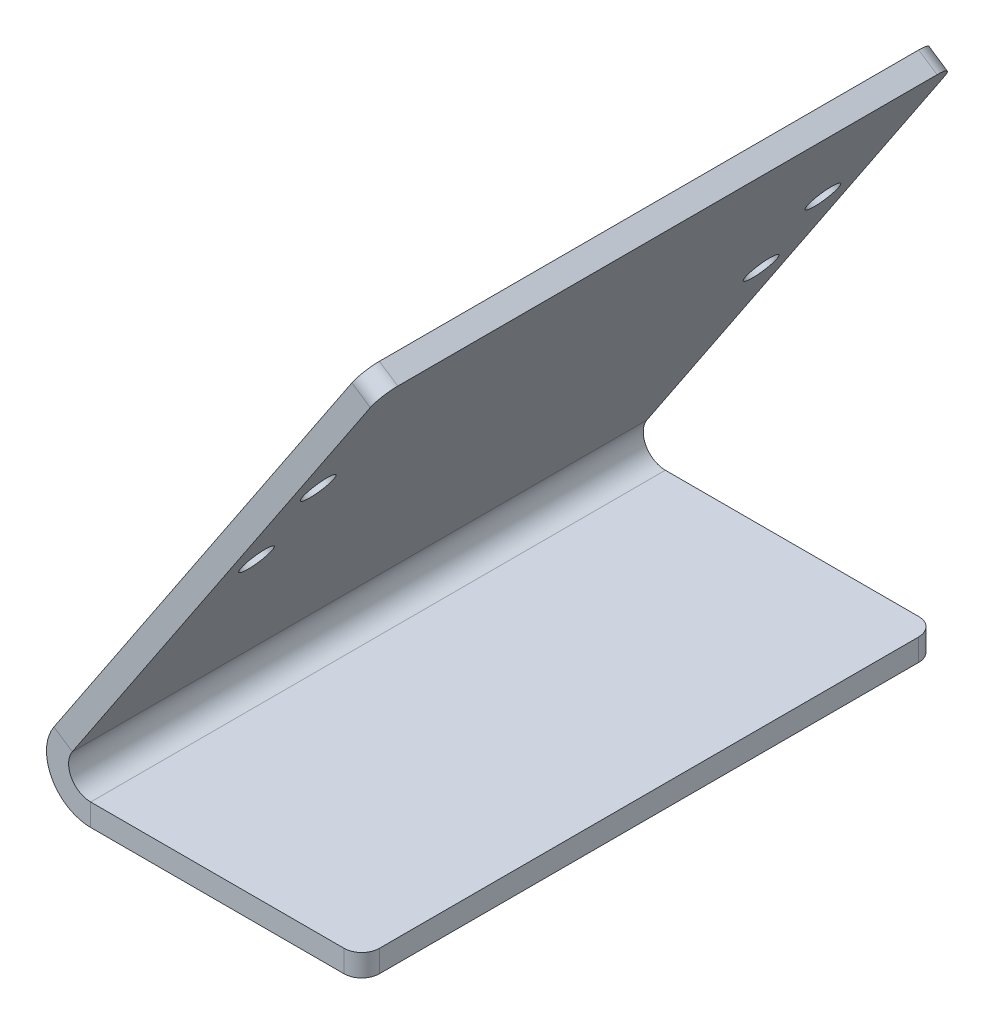
ISO-10303-21;
HEADER;
FILE_DESCRIPTION(('STEP AP214'),'2;1');
FILE_NAME('part.step','',(''),(''),'','','');
FILE_SCHEMA(('AUTOMOTIVE_DESIGN { 1 0 10303 214 1 1 1 1 }'));
ENDSEC;
DATA;
#1=APPLICATION_CONTEXT('core data for automotive mechanical design processes');
#2=APPLICATION_PROTOCOL_DEFINITION('international standard','automotive_design',2000,#1);
#3=PRODUCT_CONTEXT('',#1,'mechanical');
#4=PRODUCT('Part','Part','',(#3));
#5=PRODUCT_RELATED_PRODUCT_CATEGORY('part','',(#4));
#6=PRODUCT_DEFINITION_FORMATION('','',#4);
#7=PRODUCT_DEFINITION_CONTEXT('part definition',#1,'design');
#8=PRODUCT_DEFINITION('design','',#6,#7);
#9=PRODUCT_DEFINITION_SHAPE('','',#8);
#10=(LENGTH_UNIT() NAMED_UNIT(*) SI_UNIT(.MILLI.,.METRE.));
#11=(NAMED_UNIT(*) PLANE_ANGLE_UNIT() SI_UNIT($,.RADIAN.));
#12=(NAMED_UNIT(*) SI_UNIT($,.STERADIAN.) SOLID_ANGLE_UNIT());
#13=UNCERTAINTY_MEASURE_WITH_UNIT(LENGTH_MEASURE(1.E-05),#10,'distance_accuracy_value','');
#14=(GEOMETRIC_REPRESENTATION_CONTEXT(3) GLOBAL_UNCERTAINTY_ASSIGNED_CONTEXT((#13)) GLOBAL_UNIT_ASSIGNED_CONTEXT((#10,
#11,#12)) REPRESENTATION_CONTEXT('',''));
#15=CARTESIAN_POINT('',(0.,0.,0.));
#16=DIRECTION('',(0.,0.,1.));
#17=DIRECTION('',(1.,0.,0.));
#18=AXIS2_PLACEMENT_3D('',#15,#16,#17);
#19=CARTESIAN_POINT('',(0.,-38.1,-41.275));
#20=DIRECTION('',(0.,0.,1.));
#21=DIRECTION('',(-1.,0.,0.));
#22=AXIS2_PLACEMENT_3D('',#19,#20,#21);
#23=PLANE('',#22);
#24=DIRECTION('',(1.,0.,0.));
#25=VECTOR('',#24,1.);
#26=CARTESIAN_POINT('',(0.,-34.925,-41.275));
#27=LINE('',#26,#25);
#28=CARTESIAN_POINT('',(22.86,-34.925,-41.275));
#29=VERTEX_POINT('',#28);
#30=CARTESIAN_POINT('',(-13.5349164669346,-34.925,-41.275));
#31=VERTEX_POINT('',#30);
#32=EDGE_CURVE('E194',#29,#31,#27,.F.);
#33=ORIENTED_EDGE('',*,*,#32,.F.);
#34=DIRECTION('',(0.,1.,0.));
#35=VECTOR('',#34,1.);
#36=CARTESIAN_POINT('',(22.86,-38.1,-41.275));
#37=LINE('',#36,#35);
#38=CARTESIAN_POINT('',(22.86,-38.1,-41.275));
#39=VERTEX_POINT('',#38);
#40=EDGE_CURVE('E136',#29,#39,#37,.F.);
#41=ORIENTED_EDGE('',*,*,#40,.T.);
#42=DIRECTION('',(-1.,0.,0.));
#43=VECTOR('',#42,1.);
#44=CARTESIAN_POINT('',(0.,-38.1,-41.275));
#45=LINE('',#44,#43);
#46=CARTESIAN_POINT('',(-13.5349164669346,-38.1,-41.275));
#47=VERTEX_POINT('',#46);
#48=EDGE_CURVE('E130',#39,#47,#45,.T.);
#49=ORIENTED_EDGE('',*,*,#48,.T.);
#50=DIRECTION('',(0.,-1.,0.));
#51=VECTOR('',#50,1.);
#52=CARTESIAN_POINT('',(-13.5349164669346,-38.1,-41.275));
#53=LINE('',#52,#51);
#54=EDGE_CURVE('E133',#31,#47,#53,.T.);
#55=ORIENTED_EDGE('',*,*,#54,.F.);
#56=EDGE_LOOP('',(#33,#41,#49,#55));
#57=FACE_BOUND('',#56,.T.);
#58=ADVANCED_FACE('F38',(#57),#23,.F.);
#59=CARTESIAN_POINT('',(25.4,-38.1,41.275));
#60=DIRECTION('',(-1.,0.,0.));
#61=DIRECTION('',(0.,0.,-1.));
#62=AXIS2_PLACEMENT_3D('',#59,#60,#61);
#63=PLANE('',#62);
#64=DIRECTION('',(0.,0.,1.));
#65=VECTOR('',#64,1.);
#66=CARTESIAN_POINT('',(25.4,-34.925,41.275));
#67=LINE('',#66,#65);
#68=CARTESIAN_POINT('',(25.4,-34.925,38.735));
#69=VERTEX_POINT('',#68);
#70=CARTESIAN_POINT('',(25.4,-34.925,-38.735));
#71=VERTEX_POINT('',#70);
#72=EDGE_CURVE('E196',#69,#71,#67,.F.);
#73=ORIENTED_EDGE('',*,*,#72,.F.);
#74=DIRECTION('',(0.,-1.,0.));
#75=VECTOR('',#74,1.);
#76=CARTESIAN_POINT('',(25.4,-38.1,38.735));
#77=LINE('',#76,#75);
#78=CARTESIAN_POINT('',(25.4,-38.1,38.735));
#79=VERTEX_POINT('',#78);
#80=EDGE_CURVE('E209',#69,#79,#77,.T.);
#81=ORIENTED_EDGE('',*,*,#80,.T.);
#82=DIRECTION('',(0.,0.,-1.));
#83=VECTOR('',#82,1.);
#84=CARTESIAN_POINT('',(25.4,-38.1,41.275));
#85=LINE('',#84,#83);
#86=CARTESIAN_POINT('',(25.4,-38.1,-38.735));
#87=VERTEX_POINT('',#86);
#88=EDGE_CURVE('E139',#79,#87,#85,.T.);
#89=ORIENTED_EDGE('',*,*,#88,.T.);
#90=DIRECTION('',(0.,1.,0.));
#91=VECTOR('',#90,1.);
#92=CARTESIAN_POINT('',(25.4,-38.1,-38.735));
#93=LINE('',#92,#91);
#94=EDGE_CURVE('E152',#87,#71,#93,.T.);
#95=ORIENTED_EDGE('',*,*,#94,.T.);
#96=EDGE_LOOP('',(#73,#81,#89,#95));
#97=FACE_BOUND('',#96,.T.);
#98=ADVANCED_FACE('F306',(#97),#63,.F.);
#99=CARTESIAN_POINT('',(0.,-38.1,41.275));
#100=DIRECTION('',(0.,0.,1.));
#101=DIRECTION('',(-1.,0.,0.));
#102=AXIS2_PLACEMENT_3D('',#99,#100,#101);
#103=PLANE('',#102);
#104=DIRECTION('',(-1.,0.,0.));
#105=VECTOR('',#104,1.);
#106=CARTESIAN_POINT('',(0.,-38.1,41.275));
#107=LINE('',#106,#105);
#108=CARTESIAN_POINT('',(22.86,-38.1,41.275));
#109=VERTEX_POINT('',#108);
#110=CARTESIAN_POINT('',(-13.5349164669346,-38.1,41.275));
#111=VERTEX_POINT('',#110);
#112=EDGE_CURVE('E167',#109,#111,#107,.T.);
#113=ORIENTED_EDGE('',*,*,#112,.F.);
#114=DIRECTION('',(0.,1.,0.));
#115=VECTOR('',#114,1.);
#116=CARTESIAN_POINT('',(22.86,-38.1,41.275));
#117=LINE('',#116,#115);
#118=CARTESIAN_POINT('',(22.86,-34.925,41.275));
#119=VERTEX_POINT('',#118);
#120=EDGE_CURVE('E216',#109,#119,#117,.T.);
#121=ORIENTED_EDGE('',*,*,#120,.T.);
#122=DIRECTION('',(1.,0.,0.));
#123=VECTOR('',#122,1.);
#124=CARTESIAN_POINT('',(0.,-34.925,41.275));
#125=LINE('',#124,#123);
#126=CARTESIAN_POINT('',(-13.5349164669346,-34.925,41.275));
#127=VERTEX_POINT('',#126);
#128=EDGE_CURVE('E187',#119,#127,#125,.F.);
#129=ORIENTED_EDGE('',*,*,#128,.T.);
#130=DIRECTION('',(0.,-1.,0.));
#131=VECTOR('',#130,1.);
#132=CARTESIAN_POINT('',(-13.5349164669346,-38.1,41.275));
#133=LINE('',#132,#131);
#134=EDGE_CURVE('E153',#127,#111,#133,.T.);
#135=ORIENTED_EDGE('',*,*,#134,.T.);
#136=EDGE_LOOP('',(#113,#121,#129,#135));
#137=FACE_BOUND('',#136,.T.);
#138=ADVANCED_FACE('F312',(#137),#103,.T.);
#139=CARTESIAN_POINT('',(-13.5349164669346,-31.75,41.275));
#140=DIRECTION('',(0.,0.,1.));
#141=DIRECTION('',(1.,0.,0.));
#142=AXIS2_PLACEMENT_3D('',#139,#140,#141);
#143=PLANE('',#142);
#144=ORIENTED_EDGE('',*,*,#134,.F.);
#145=CARTESIAN_POINT('',(-13.5349164669346,-31.75,41.275));
#146=DIRECTION('',(0.,0.,1.));
#147=DIRECTION('',(1.,0.,0.));
#148=AXIS2_PLACEMENT_3D('',#145,#146,#147);
#149=CIRCLE('',#148,3.175);
#150=CARTESIAN_POINT('',(-16.1766761514572,-29.9888268769849,41.275));
#151=VERTEX_POINT('',#150);
#152=EDGE_CURVE('E191',#127,#151,#149,.F.);
#153=ORIENTED_EDGE('',*,*,#152,.T.);
#154=DIRECTION('',(-0.832050294337844,0.554700196225229,0.));
#155=VECTOR('',#154,1.);
#156=CARTESIAN_POINT('',(-18.8184358359799,-28.2276537539698,41.275));
#157=LINE('',#156,#155);
#158=CARTESIAN_POINT('',(-18.8184358359799,-28.2276537539698,41.275));
#159=VERTEX_POINT('',#158);
#160=EDGE_CURVE('E202',#151,#159,#157,.T.);
#161=ORIENTED_EDGE('',*,*,#160,.T.);
#162=CARTESIAN_POINT('',(-13.5349164669346,-31.75,41.275));
#163=DIRECTION('',(0.,0.,-1.));
#164=DIRECTION('',(-1.,0.,0.));
#165=AXIS2_PLACEMENT_3D('',#162,#163,#164);
#166=CIRCLE('',#165,6.35);
#167=EDGE_CURVE('E140',#111,#159,#166,.T.);
#168=ORIENTED_EDGE('',*,*,#167,.F.);
#169=EDGE_LOOP('',(#144,#153,#161,#168));
#170=FACE_BOUND('',#169,.T.);
#171=ADVANCED_FACE('F352',(#170),#143,.T.);
#172=CARTESIAN_POINT('',(0.,0.,41.275));
#173=DIRECTION('',(0.,0.,1.));
#174=DIRECTION('',(-0.554700196225229,-0.832050294337844,0.));
#175=AXIS2_PLACEMENT_3D('',#172,#173,#174);
#176=PLANE('',#175);
#177=DIRECTION('',(0.554700196225229,0.832050294337844,0.));
#178=VECTOR('',#177,1.);
#179=CARTESIAN_POINT('',(2.64175968452265,-1.7611731230151,41.275));
#180=LINE('',#179,#178);
#181=CARTESIAN_POINT('',(26.6328211861106,34.2254191293668,41.275));
#182=VERTEX_POINT('',#181);
#183=EDGE_CURVE('E186',#182,#151,#180,.F.);
#184=ORIENTED_EDGE('',*,*,#183,.F.);
#185=DIRECTION('',(0.832050294337844,-0.554700196225229,0.));
#186=VECTOR('',#185,1.);
#187=CARTESIAN_POINT('',(23.9910615015879,35.9865922523819,41.275));
#188=LINE('',#187,#186);
#189=CARTESIAN_POINT('',(23.9910615015879,35.9865922523819,41.275));
#190=VERTEX_POINT('',#189);
#191=EDGE_CURVE('E11',#182,#190,#188,.F.);
#192=ORIENTED_EDGE('',*,*,#191,.T.);
#193=DIRECTION('',(-0.554700196225229,-0.832050294337844,0.));
#194=VECTOR('',#193,1.);
#195=CARTESIAN_POINT('',(0.,0.,41.275));
#196=LINE('',#195,#194);
#197=EDGE_CURVE('E174',#190,#159,#196,.T.);
#198=ORIENTED_EDGE('',*,*,#197,.T.);
#199=ORIENTED_EDGE('',*,*,#160,.F.);
#200=EDGE_LOOP('',(#184,#192,#198,#199));
#201=FACE_BOUND('',#200,.T.);
#202=ADVANCED_FACE('F336',(#201),#176,.T.);
#203=CARTESIAN_POINT('',(25.4,38.1,41.275));
#204=DIRECTION('',(-0.554700196225229,-0.832050294337844,0.));
#205=DIRECTION('',(0.,0.,-1.));
#206=AXIS2_PLACEMENT_3D('',#203,#204,#205);
#207=PLANE('',#206);
#208=DIRECTION('',(0.,0.,1.));
#209=VECTOR('',#208,1.);
#210=CARTESIAN_POINT('',(28.0417596845226,36.3388268769849,41.275));
#211=LINE('',#210,#209);
#212=CARTESIAN_POINT('',(28.0417596845226,36.3388268769849,38.735));
#213=VERTEX_POINT('',#212);
#214=CARTESIAN_POINT('',(28.0417596845226,36.3388268769849,-38.735));
#215=VERTEX_POINT('',#214);
#216=EDGE_CURVE('E183',#213,#215,#211,.F.);
#217=ORIENTED_EDGE('',*,*,#216,.T.);
#218=DIRECTION('',(0.832050294337844,-0.554700196225229,0.));
#219=VECTOR('',#218,1.);
#220=CARTESIAN_POINT('',(25.4,38.1,-38.735));
#221=LINE('',#220,#219);
#222=CARTESIAN_POINT('',(25.4,38.1,-38.735));
#223=VERTEX_POINT('',#222);
#224=EDGE_CURVE('E225',#215,#223,#221,.F.);
#225=ORIENTED_EDGE('',*,*,#224,.T.);
#226=DIRECTION('',(0.,0.,-1.));
#227=VECTOR('',#226,1.);
#228=CARTESIAN_POINT('',(25.4,38.1,41.275));
#229=LINE('',#228,#227);
#230=CARTESIAN_POINT('',(25.4,38.1,38.735));
#231=VERTEX_POINT('',#230);
#232=EDGE_CURVE('E169',#231,#223,#229,.T.);
#233=ORIENTED_EDGE('',*,*,#232,.F.);
#234=DIRECTION('',(-0.832050294337844,0.554700196225229,0.));
#235=VECTOR('',#234,1.);
#236=CARTESIAN_POINT('',(25.4,38.1,38.735));
#237=LINE('',#236,#235);
#238=EDGE_CURVE('E223',#231,#213,#237,.F.);
#239=ORIENTED_EDGE('',*,*,#238,.T.);
#240=EDGE_LOOP('',(#217,#225,#233,#239));
#241=FACE_BOUND('',#240,.T.);
#242=ADVANCED_FACE('F239',(#241),#207,.F.);
#243=CARTESIAN_POINT('',(0.,0.,-41.275));
#244=DIRECTION('',(0.,0.,1.));
#245=DIRECTION('',(-0.554700196225229,-0.832050294337844,0.));
#246=AXIS2_PLACEMENT_3D('',#243,#244,#245);
#247=PLANE('',#246);
#248=DIRECTION('',(-0.554700196225229,-0.832050294337844,0.));
#249=VECTOR('',#248,1.);
#250=CARTESIAN_POINT('',(0.,0.,-41.275));
#251=LINE('',#250,#249);
#252=CARTESIAN_POINT('',(23.9910615015879,35.9865922523819,-41.275));
#253=VERTEX_POINT('',#252);
#254=CARTESIAN_POINT('',(-18.8184358359799,-28.2276537539698,-41.275));
#255=VERTEX_POINT('',#254);
#256=EDGE_CURVE('E245',#253,#255,#251,.T.);
#257=ORIENTED_EDGE('',*,*,#256,.F.);
#258=DIRECTION('',(0.832050294337844,-0.554700196225229,0.));
#259=VECTOR('',#258,1.);
#260=CARTESIAN_POINT('',(23.9910615015879,35.9865922523819,-41.275));
#261=LINE('',#260,#259);
#262=CARTESIAN_POINT('',(26.6328211861106,34.2254191293668,-41.275));
#263=VERTEX_POINT('',#262);
#264=EDGE_CURVE('E61',#253,#263,#261,.T.);
#265=ORIENTED_EDGE('',*,*,#264,.T.);
#266=DIRECTION('',(0.554700196225229,0.832050294337844,0.));
#267=VECTOR('',#266,1.);
#268=CARTESIAN_POINT('',(2.64175968452265,-1.7611731230151,-41.275));
#269=LINE('',#268,#267);
#270=CARTESIAN_POINT('',(-16.1766761514572,-29.9888268769849,-41.275));
#271=VERTEX_POINT('',#270);
#272=EDGE_CURVE('E184',#263,#271,#269,.F.);
#273=ORIENTED_EDGE('',*,*,#272,.T.);
#274=DIRECTION('',(-0.832050294337844,0.554700196225229,0.));
#275=VECTOR('',#274,1.);
#276=CARTESIAN_POINT('',(-18.8184358359799,-28.2276537539698,-41.275));
#277=LINE('',#276,#275);
#278=EDGE_CURVE('E171',#271,#255,#277,.T.);
#279=ORIENTED_EDGE('',*,*,#278,.T.);
#280=EDGE_LOOP('',(#257,#265,#273,#279));
#281=FACE_BOUND('',#280,.T.);
#282=ADVANCED_FACE('F246',(#281),#247,.F.);
#283=CARTESIAN_POINT('',(-13.5349164669346,-31.75,-41.275));
#284=DIRECTION('',(0.,0.,-1.));
#285=DIRECTION('',(-1.,0.,0.));
#286=AXIS2_PLACEMENT_3D('',#283,#284,#285);
#287=PLANE('',#286);
#288=CARTESIAN_POINT('',(-13.5349164669346,-31.75,-41.275));
#289=DIRECTION('',(0.,0.,1.));
#290=DIRECTION('',(1.,0.,0.));
#291=AXIS2_PLACEMENT_3D('',#288,#289,#290);
#292=CIRCLE('',#291,3.175);
#293=EDGE_CURVE('E151',#271,#31,#292,.T.);
#294=ORIENTED_EDGE('',*,*,#293,.T.);
#295=ORIENTED_EDGE('',*,*,#54,.T.);
#296=CARTESIAN_POINT('',(-13.5349164669346,-31.75,-41.275));
#297=DIRECTION('',(0.,0.,1.));
#298=DIRECTION('',(1.,0.,0.));
#299=AXIS2_PLACEMENT_3D('',#296,#297,#298);
#300=CIRCLE('',#299,6.35);
#301=EDGE_CURVE('E148',#255,#47,#300,.T.);
#302=ORIENTED_EDGE('',*,*,#301,.F.);
#303=ORIENTED_EDGE('',*,*,#278,.F.);
#304=EDGE_LOOP('',(#294,#295,#302,#303));
#305=FACE_BOUND('',#304,.T.);
#306=ADVANCED_FACE('F146',(#305),#287,.T.);
#307=CARTESIAN_POINT('',(0.,0.,41.275));
#308=DIRECTION('',(0.832050294337844,-0.554700196225229,0.));
#309=DIRECTION('',(0.554700196225229,0.832050294337844,0.));
#310=AXIS2_PLACEMENT_3D('',#307,#308,#309);
#311=PLANE('',#310);
#312=CARTESIAN_POINT('',(11.4828487620585,17.2242731430877,36.2458));
#313=DIRECTION('',(-0.832050294337844,0.554700196225229,0.));
#314=DIRECTION('',(-0.554700196225229,-0.832050294337844,0.));
#315=AXIS2_PLACEMENT_3D('',#312,#313,#314);
#316=CIRCLE('',#315,2.2479);
#317=CARTESIAN_POINT('',(10.2359381909638,15.3539072864457,36.2458));
#318=VERTEX_POINT('',#317);
#319=EDGE_CURVE('E255',#318,#318,#316,.T.);
#320=ORIENTED_EDGE('',*,*,#319,.F.);
#321=EDGE_LOOP('',(#320));
#322=FACE_BOUND('',#321,.T.);
#323=CARTESIAN_POINT('',(2.60653622206235,3.90980433309352,-36.2458));
#324=DIRECTION('',(-0.832050294337844,0.554700196225229,0.));
#325=DIRECTION('',(-0.554700196225229,-0.832050294337844,0.));
#326=AXIS2_PLACEMENT_3D('',#323,#324,#325);
#327=CIRCLE('',#326,2.2479);
#328=CARTESIAN_POINT('',(1.35962565096766,2.03943847645148,-36.2458));
#329=VERTEX_POINT('',#328);
#330=EDGE_CURVE('E267',#329,#329,#327,.T.);
#331=ORIENTED_EDGE('',*,*,#330,.F.);
#332=EDGE_LOOP('',(#331));
#333=FACE_BOUND('',#332,.T.);
#334=CARTESIAN_POINT('',(2.60653622206235,3.90980433309353,36.2458));
#335=DIRECTION('',(-0.832050294337844,0.554700196225229,0.));
#336=DIRECTION('',(-0.554700196225229,-0.832050294337844,0.));
#337=AXIS2_PLACEMENT_3D('',#334,#335,#336);
#338=CIRCLE('',#337,2.2479);
#339=CARTESIAN_POINT('',(1.35962565096766,2.03943847645149,36.2458));
#340=VERTEX_POINT('',#339);
#341=EDGE_CURVE('E261',#340,#340,#338,.T.);
#342=ORIENTED_EDGE('',*,*,#341,.F.);
#343=EDGE_LOOP('',(#342));
#344=FACE_BOUND('',#343,.T.);
#345=CARTESIAN_POINT('',(11.4828487620585,17.2242731430877,-36.2458));
#346=DIRECTION('',(-0.832050294337844,0.554700196225229,0.));
#347=DIRECTION('',(-0.554700196225229,-0.832050294337844,0.));
#348=AXIS2_PLACEMENT_3D('',#345,#346,#347);
#349=CIRCLE('',#348,2.2479);
#350=CARTESIAN_POINT('',(10.2359381909638,15.3539072864457,-36.2458));
#351=VERTEX_POINT('',#350);
#352=EDGE_CURVE('E201',#351,#351,#349,.T.);
#353=ORIENTED_EDGE('',*,*,#352,.F.);
#354=EDGE_LOOP('',(#353));
#355=FACE_BOUND('',#354,.T.);
#356=ORIENTED_EDGE('',*,*,#232,.T.);
#357=CARTESIAN_POINT('',(23.9910615015879,35.9865922523819,-38.735));
#358=DIRECTION('',(0.832050294337844,-0.554700196225229,0.));
#359=DIRECTION('',(0.554700196225229,0.832050294337844,0.));
#360=AXIS2_PLACEMENT_3D('',#357,#358,#359);
#361=CIRCLE('',#360,2.54);
#362=EDGE_CURVE('E230',#223,#253,#361,.F.);
#363=ORIENTED_EDGE('',*,*,#362,.T.);
#364=ORIENTED_EDGE('',*,*,#256,.T.);
#365=DIRECTION('',(0.,0.,-1.));
#366=VECTOR('',#365,1.);
#367=CARTESIAN_POINT('',(-18.8184358359799,-28.2276537539698,41.275));
#368=LINE('',#367,#366);
#369=EDGE_CURVE('E161',#255,#159,#368,.F.);
#370=ORIENTED_EDGE('',*,*,#369,.T.);
#371=ORIENTED_EDGE('',*,*,#197,.F.);
#372=CARTESIAN_POINT('',(23.9910615015879,35.9865922523819,38.735));
#373=DIRECTION('',(0.832050294337844,-0.554700196225229,0.));
#374=DIRECTION('',(0.554700196225229,0.832050294337844,0.));
#375=AXIS2_PLACEMENT_3D('',#372,#373,#374);
#376=CIRCLE('',#375,2.54);
#377=EDGE_CURVE('E228',#190,#231,#376,.F.);
#378=ORIENTED_EDGE('',*,*,#377,.T.);
#379=EDGE_LOOP('',(#356,#363,#364,#370,#371,#378));
#380=FACE_BOUND('',#379,.T.);
#381=ADVANCED_FACE('F244',(#322,#333,#344,#355,#380),#311,.F.);
#382=CARTESIAN_POINT('',(0.,-38.1,41.275));
#383=DIRECTION('',(0.,-1.,0.));
#384=DIRECTION('',(1.,0.,0.));
#385=AXIS2_PLACEMENT_3D('',#382,#383,#384);
#386=PLANE('',#385);
#387=ORIENTED_EDGE('',*,*,#88,.F.);
#388=CARTESIAN_POINT('',(22.86,-38.1,38.735));
#389=DIRECTION('',(0.,-1.,0.));
#390=DIRECTION('',(1.,0.,0.));
#391=AXIS2_PLACEMENT_3D('',#388,#389,#390);
#392=CIRCLE('',#391,2.54);
#393=EDGE_CURVE('E214',#79,#109,#392,.T.);
#394=ORIENTED_EDGE('',*,*,#393,.T.);
#395=ORIENTED_EDGE('',*,*,#112,.T.);
#396=DIRECTION('',(0.,0.,-1.));
#397=VECTOR('',#396,1.);
#398=CARTESIAN_POINT('',(-13.5349164669346,-38.1,-41.275));
#399=LINE('',#398,#397);
#400=EDGE_CURVE('E159',#111,#47,#399,.T.);
#401=ORIENTED_EDGE('',*,*,#400,.T.);
#402=ORIENTED_EDGE('',*,*,#48,.F.);
#403=CARTESIAN_POINT('',(22.86,-38.1,-38.735));
#404=DIRECTION('',(0.,-1.,0.));
#405=DIRECTION('',(1.,0.,0.));
#406=AXIS2_PLACEMENT_3D('',#403,#404,#405);
#407=CIRCLE('',#406,2.54);
#408=EDGE_CURVE('E212',#39,#87,#407,.T.);
#409=ORIENTED_EDGE('',*,*,#408,.T.);
#410=EDGE_LOOP('',(#387,#394,#395,#401,#402,#409));
#411=FACE_BOUND('',#410,.T.);
#412=ADVANCED_FACE('F165',(#411),#386,.T.);
#413=CARTESIAN_POINT('',(-13.5349164669346,-31.75,41.275));
#414=DIRECTION('',(0.,0.,1.));
#415=DIRECTION('',(1.,0.,0.));
#416=AXIS2_PLACEMENT_3D('',#413,#414,#415);
#417=CYLINDRICAL_SURFACE('',#416,6.35);
#418=ORIENTED_EDGE('',*,*,#167,.T.);
#419=ORIENTED_EDGE('',*,*,#369,.F.);
#420=ORIENTED_EDGE('',*,*,#301,.T.);
#421=ORIENTED_EDGE('',*,*,#400,.F.);
#422=EDGE_LOOP('',(#418,#419,#420,#421));
#423=FACE_BOUND('',#422,.T.);
#424=ADVANCED_FACE('F158',(#423),#417,.T.);
#425=CARTESIAN_POINT('',(2.64175968452265,-1.7611731230151,41.275));
#426=DIRECTION('',(0.832050294337844,-0.554700196225229,0.));
#427=DIRECTION('',(0.554700196225229,0.832050294337844,0.));
#428=AXIS2_PLACEMENT_3D('',#425,#426,#427);
#429=PLANE('',#428);
#430=CARTESIAN_POINT('',(14.1246084465811,15.4631000200726,36.2458));
#431=DIRECTION('',(0.832050294337844,-0.554700196225229,0.));
#432=DIRECTION('',(0.554700196225229,0.832050294337844,0.));
#433=AXIS2_PLACEMENT_3D('',#430,#431,#432);
#434=CIRCLE('',#433,2.2479);
#435=CARTESIAN_POINT('',(15.3715190176758,17.3334658767146,36.2458));
#436=VERTEX_POINT('',#435);
#437=EDGE_CURVE('E270',#436,#436,#434,.F.);
#438=ORIENTED_EDGE('',*,*,#437,.T.);
#439=EDGE_LOOP('',(#438));
#440=FACE_BOUND('',#439,.T.);
#441=CARTESIAN_POINT('',(5.248295906585,2.14863121007842,-36.2458));
#442=DIRECTION('',(0.832050294337844,-0.554700196225229,0.));
#443=DIRECTION('',(0.554700196225229,0.832050294337844,0.));
#444=AXIS2_PLACEMENT_3D('',#441,#442,#443);
#445=CIRCLE('',#444,2.2479);
#446=CARTESIAN_POINT('',(6.49520647767969,4.01899706672046,-36.2458));
#447=VERTEX_POINT('',#446);
#448=EDGE_CURVE('E264',#447,#447,#445,.F.);
#449=ORIENTED_EDGE('',*,*,#448,.T.);
#450=EDGE_LOOP('',(#449));
#451=FACE_BOUND('',#450,.T.);
#452=CARTESIAN_POINT('',(5.248295906585,2.14863121007843,36.2458));
#453=DIRECTION('',(0.832050294337844,-0.554700196225229,0.));
#454=DIRECTION('',(0.554700196225229,0.832050294337844,0.));
#455=AXIS2_PLACEMENT_3D('',#452,#453,#454);
#456=CIRCLE('',#455,2.2479);
#457=CARTESIAN_POINT('',(6.49520647767969,4.01899706672047,36.2458));
#458=VERTEX_POINT('',#457);
#459=EDGE_CURVE('E258',#458,#458,#456,.F.);
#460=ORIENTED_EDGE('',*,*,#459,.T.);
#461=EDGE_LOOP('',(#460));
#462=FACE_BOUND('',#461,.T.);
#463=CARTESIAN_POINT('',(14.1246084465811,15.4631000200726,-36.2458));
#464=DIRECTION('',(0.832050294337844,-0.554700196225229,0.));
#465=DIRECTION('',(0.554700196225229,0.832050294337844,0.));
#466=AXIS2_PLACEMENT_3D('',#463,#464,#465);
#467=CIRCLE('',#466,2.2479);
#468=CARTESIAN_POINT('',(15.3715190176758,17.3334658767146,-36.2458));
#469=VERTEX_POINT('',#468);
#470=EDGE_CURVE('E252',#469,#469,#467,.F.);
#471=ORIENTED_EDGE('',*,*,#470,.T.);
#472=EDGE_LOOP('',(#471));
#473=FACE_BOUND('',#472,.T.);
#474=ORIENTED_EDGE('',*,*,#272,.F.);
#475=CARTESIAN_POINT('',(26.6328211861106,34.2254191293668,-38.735));
#476=DIRECTION('',(0.832050294337844,-0.554700196225229,0.));
#477=DIRECTION('',(0.554700196225229,0.832050294337844,0.));
#478=AXIS2_PLACEMENT_3D('',#475,#476,#477);
#479=CIRCLE('',#478,2.54);
#480=EDGE_CURVE('E46',#263,#215,#479,.T.);
#481=ORIENTED_EDGE('',*,*,#480,.T.);
#482=ORIENTED_EDGE('',*,*,#216,.F.);
#483=CARTESIAN_POINT('',(26.6328211861106,34.2254191293668,38.735));
#484=DIRECTION('',(0.832050294337844,-0.554700196225229,0.));
#485=DIRECTION('',(0.554700196225229,0.832050294337844,0.));
#486=AXIS2_PLACEMENT_3D('',#483,#484,#485);
#487=CIRCLE('',#486,2.54);
#488=EDGE_CURVE('E53',#213,#182,#487,.T.);
#489=ORIENTED_EDGE('',*,*,#488,.T.);
#490=ORIENTED_EDGE('',*,*,#183,.T.);
#491=DIRECTION('',(0.,0.,1.));
#492=VECTOR('',#491,1.);
#493=CARTESIAN_POINT('',(-16.1766761514572,-29.9888268769849,41.275));
#494=LINE('',#493,#492);
#495=EDGE_CURVE('E162',#271,#151,#494,.T.);
#496=ORIENTED_EDGE('',*,*,#495,.F.);
#497=EDGE_LOOP('',(#474,#481,#482,#489,#490,#496));
#498=FACE_BOUND('',#497,.T.);
#499=ADVANCED_FACE('F234',(#440,#451,#462,#473,#498),#429,.T.);
#500=CARTESIAN_POINT('',(0.,-34.925,41.275));
#501=DIRECTION('',(0.,-1.,0.));
#502=DIRECTION('',(1.,0.,0.));
#503=AXIS2_PLACEMENT_3D('',#500,#501,#502);
#504=PLANE('',#503);
#505=ORIENTED_EDGE('',*,*,#128,.F.);
#506=CARTESIAN_POINT('',(22.86,-34.925,38.735));
#507=DIRECTION('',(0.,-1.,0.));
#508=DIRECTION('',(1.,0.,0.));
#509=AXIS2_PLACEMENT_3D('',#506,#507,#508);
#510=CIRCLE('',#509,2.54);
#511=EDGE_CURVE('E220',#119,#69,#510,.F.);
#512=ORIENTED_EDGE('',*,*,#511,.T.);
#513=ORIENTED_EDGE('',*,*,#72,.T.);
#514=CARTESIAN_POINT('',(22.86,-34.925,-38.735));
#515=DIRECTION('',(0.,-1.,0.));
#516=DIRECTION('',(1.,0.,0.));
#517=AXIS2_PLACEMENT_3D('',#514,#515,#516);
#518=CIRCLE('',#517,2.54);
#519=EDGE_CURVE('E218',#71,#29,#518,.F.);
#520=ORIENTED_EDGE('',*,*,#519,.T.);
#521=ORIENTED_EDGE('',*,*,#32,.T.);
#522=DIRECTION('',(0.,0.,1.));
#523=VECTOR('',#522,1.);
#524=CARTESIAN_POINT('',(-13.5349164669346,-34.925,41.275));
#525=LINE('',#524,#523);
#526=EDGE_CURVE('E181',#127,#31,#525,.F.);
#527=ORIENTED_EDGE('',*,*,#526,.F.);
#528=EDGE_LOOP('',(#505,#512,#513,#520,#521,#527));
#529=FACE_BOUND('',#528,.T.);
#530=ADVANCED_FACE('F300',(#529),#504,.F.);
#531=CARTESIAN_POINT('',(-13.5349164669346,-31.75,41.275));
#532=DIRECTION('',(0.,0.,1.));
#533=DIRECTION('',(1.,0.,0.));
#534=AXIS2_PLACEMENT_3D('',#531,#532,#533);
#535=CYLINDRICAL_SURFACE('',#534,3.175);
#536=ORIENTED_EDGE('',*,*,#152,.F.);
#537=ORIENTED_EDGE('',*,*,#526,.T.);
#538=ORIENTED_EDGE('',*,*,#293,.F.);
#539=ORIENTED_EDGE('',*,*,#495,.T.);
#540=EDGE_LOOP('',(#536,#537,#538,#539));
#541=FACE_BOUND('',#540,.T.);
#542=ADVANCED_FACE('F290',(#541),#535,.F.);
#543=CARTESIAN_POINT('',(48.4821439282665,-7.44192363438429,-36.2458));
#544=DIRECTION('',(-0.832050294337844,0.554700196225229,0.));
#545=DIRECTION('',(-0.554700196225229,-0.832050294337844,0.));
#546=AXIS2_PLACEMENT_3D('',#543,#544,#545);
#547=CYLINDRICAL_SURFACE('',#546,2.2479);
#548=ORIENTED_EDGE('',*,*,#470,.F.);
#549=EDGE_LOOP('',(#548));
#550=FACE_BOUND('',#549,.T.);
#551=ORIENTED_EDGE('',*,*,#352,.T.);
#552=EDGE_LOOP('',(#551));
#553=FACE_BOUND('',#552,.T.);
#554=ADVANCED_FACE('F287',(#550,#553),#547,.F.);
#555=CARTESIAN_POINT('',(39.6058313882703,-20.7563924443785,36.2458));
#556=DIRECTION('',(-0.832050294337844,0.554700196225229,0.));
#557=DIRECTION('',(-0.554700196225229,-0.832050294337844,0.));
#558=AXIS2_PLACEMENT_3D('',#555,#556,#557);
#559=CYLINDRICAL_SURFACE('',#558,2.2479);
#560=ORIENTED_EDGE('',*,*,#459,.F.);
#561=EDGE_LOOP('',(#560));
#562=FACE_BOUND('',#561,.T.);
#563=ORIENTED_EDGE('',*,*,#341,.T.);
#564=EDGE_LOOP('',(#563));
#565=FACE_BOUND('',#564,.T.);
#566=ADVANCED_FACE('F289',(#562,#565),#559,.F.);
#567=CARTESIAN_POINT('',(39.6058313882703,-20.7563924443785,-36.2458));
#568=DIRECTION('',(-0.832050294337844,0.554700196225229,0.));
#569=DIRECTION('',(-0.554700196225229,-0.832050294337844,0.));
#570=AXIS2_PLACEMENT_3D('',#567,#568,#569);
#571=CYLINDRICAL_SURFACE('',#570,2.2479);
#572=ORIENTED_EDGE('',*,*,#448,.F.);
#573=EDGE_LOOP('',(#572));
#574=FACE_BOUND('',#573,.T.);
#575=ORIENTED_EDGE('',*,*,#330,.T.);
#576=EDGE_LOOP('',(#575));
#577=FACE_BOUND('',#576,.T.);
#578=ADVANCED_FACE('F297',(#574,#577),#571,.F.);
#579=CARTESIAN_POINT('',(48.4821439282665,-7.44192363438428,36.2458));
#580=DIRECTION('',(-0.832050294337844,0.554700196225229,0.));
#581=DIRECTION('',(-0.554700196225229,-0.832050294337844,0.));
#582=AXIS2_PLACEMENT_3D('',#579,#580,#581);
#583=CYLINDRICAL_SURFACE('',#582,2.2479);
#584=ORIENTED_EDGE('',*,*,#437,.F.);
#585=EDGE_LOOP('',(#584));
#586=FACE_BOUND('',#585,.T.);
#587=ORIENTED_EDGE('',*,*,#319,.T.);
#588=EDGE_LOOP('',(#587));
#589=FACE_BOUND('',#588,.T.);
#590=ADVANCED_FACE('F276',(#586,#589),#583,.F.);
#591=CARTESIAN_POINT('',(22.86,-38.1,38.735));
#592=DIRECTION('',(0.,1.,0.));
#593=DIRECTION('',(-1.,0.,0.));
#594=AXIS2_PLACEMENT_3D('',#591,#592,#593);
#595=CYLINDRICAL_SURFACE('',#594,2.54);
#596=ORIENTED_EDGE('',*,*,#511,.F.);
#597=ORIENTED_EDGE('',*,*,#120,.F.);
#598=ORIENTED_EDGE('',*,*,#393,.F.);
#599=ORIENTED_EDGE('',*,*,#80,.F.);
#600=EDGE_LOOP('',(#596,#597,#598,#599));
#601=FACE_BOUND('',#600,.T.);
#602=ADVANCED_FACE('F319',(#601),#595,.T.);
#603=CARTESIAN_POINT('',(22.86,-38.1,-38.735));
#604=DIRECTION('',(0.,-1.,0.));
#605=DIRECTION('',(1.,0.,0.));
#606=AXIS2_PLACEMENT_3D('',#603,#604,#605);
#607=CYLINDRICAL_SURFACE('',#606,2.54);
#608=ORIENTED_EDGE('',*,*,#519,.F.);
#609=ORIENTED_EDGE('',*,*,#94,.F.);
#610=ORIENTED_EDGE('',*,*,#408,.F.);
#611=ORIENTED_EDGE('',*,*,#40,.F.);
#612=EDGE_LOOP('',(#608,#609,#610,#611));
#613=FACE_BOUND('',#612,.T.);
#614=ADVANCED_FACE('F322',(#613),#607,.T.);
#615=CARTESIAN_POINT('',(23.9910615015879,35.9865922523819,-38.735));
#616=DIRECTION('',(-0.832050294337844,0.554700196225229,0.));
#617=DIRECTION('',(-0.554700196225229,-0.832050294337844,0.));
#618=AXIS2_PLACEMENT_3D('',#615,#616,#617);
#619=CYLINDRICAL_SURFACE('',#618,2.54);
#620=ORIENTED_EDGE('',*,*,#480,.F.);
#621=ORIENTED_EDGE('',*,*,#264,.F.);
#622=ORIENTED_EDGE('',*,*,#362,.F.);
#623=ORIENTED_EDGE('',*,*,#224,.F.);
#624=EDGE_LOOP('',(#620,#621,#622,#623));
#625=FACE_BOUND('',#624,.T.);
#626=ADVANCED_FACE('F242',(#625),#619,.T.);
#627=CARTESIAN_POINT('',(23.9910615015879,35.9865922523819,38.735));
#628=DIRECTION('',(0.832050294337844,-0.554700196225229,0.));
#629=DIRECTION('',(0.554700196225229,0.832050294337844,0.));
#630=AXIS2_PLACEMENT_3D('',#627,#628,#629);
#631=CYLINDRICAL_SURFACE('',#630,2.54);
#632=ORIENTED_EDGE('',*,*,#488,.F.);
#633=ORIENTED_EDGE('',*,*,#238,.F.);
#634=ORIENTED_EDGE('',*,*,#377,.F.);
#635=ORIENTED_EDGE('',*,*,#191,.F.);
#636=EDGE_LOOP('',(#632,#633,#634,#635));
#637=FACE_BOUND('',#636,.T.);
#638=ADVANCED_FACE('F40',(#637),#631,.T.);
#639=CLOSED_SHELL('',(#58,#98,#138,#171,#202,#242,#282,#306,#381,#412,#424,#499,#530,#542,#554,
#566,#578,#590,#602,#614,#626,#638));
#640=MANIFOLD_SOLID_BREP('B2',#639);
#641=ADVANCED_BREP_SHAPE_REPRESENTATION('',(#18,#640),#14);
#642=SHAPE_DEFINITION_REPRESENTATION(#9,#641);
ENDSEC;
END-ISO-10303-21;
